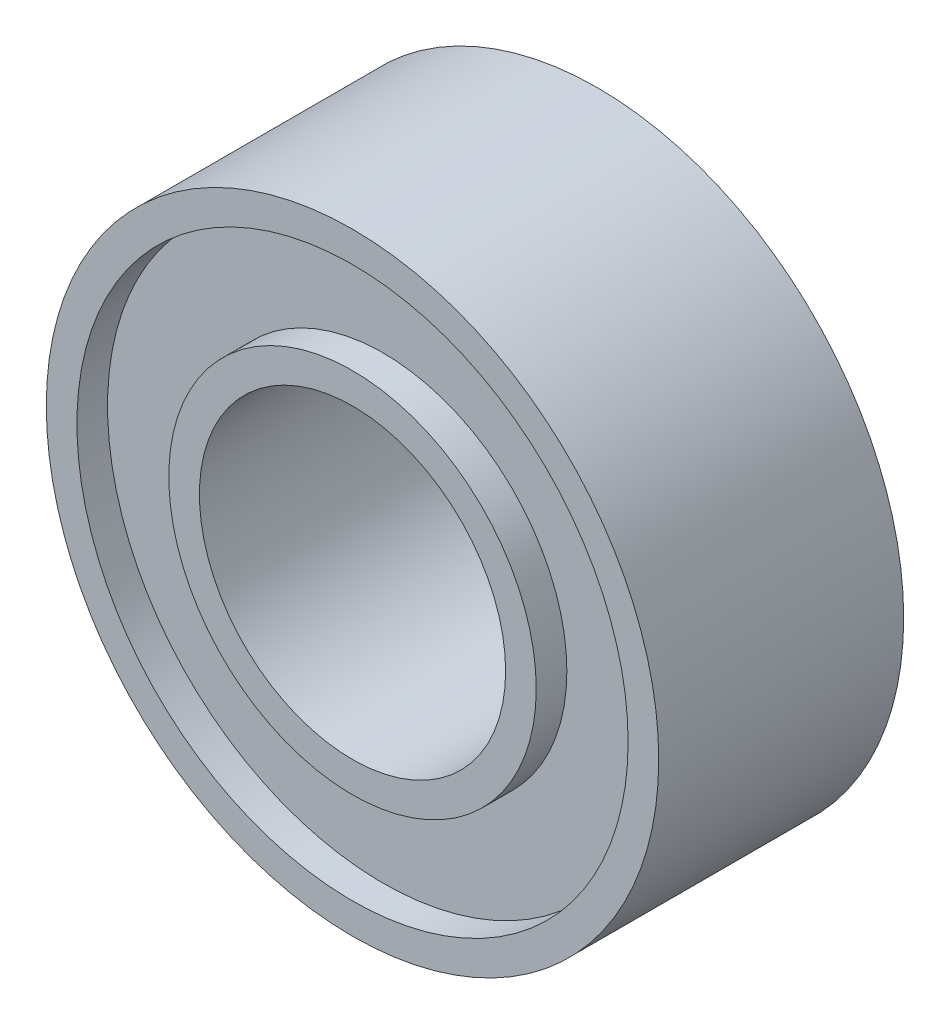
ISO-10303-21;
HEADER;
FILE_DESCRIPTION(('STEP AP214'),'2;1');
FILE_NAME('part.step','',(''),(''),'','','');
FILE_SCHEMA(('AUTOMOTIVE_DESIGN { 1 0 10303 214 1 1 1 1 }'));
ENDSEC;
DATA;
#1=APPLICATION_CONTEXT('core data for automotive mechanical design processes');
#2=APPLICATION_PROTOCOL_DEFINITION('international standard','automotive_design',2000,#1);
#3=PRODUCT_CONTEXT('',#1,'mechanical');
#4=PRODUCT('Part','Part','',(#3));
#5=PRODUCT_RELATED_PRODUCT_CATEGORY('part','',(#4));
#6=PRODUCT_DEFINITION_FORMATION('','',#4);
#7=PRODUCT_DEFINITION_CONTEXT('part definition',#1,'design');
#8=PRODUCT_DEFINITION('design','',#6,#7);
#9=PRODUCT_DEFINITION_SHAPE('','',#8);
#10=(LENGTH_UNIT() NAMED_UNIT(*) SI_UNIT(.MILLI.,.METRE.));
#11=(NAMED_UNIT(*) PLANE_ANGLE_UNIT() SI_UNIT($,.RADIAN.));
#12=(NAMED_UNIT(*) SI_UNIT($,.STERADIAN.) SOLID_ANGLE_UNIT());
#13=UNCERTAINTY_MEASURE_WITH_UNIT(LENGTH_MEASURE(1.E-05),#10,'distance_accuracy_value','');
#14=(GEOMETRIC_REPRESENTATION_CONTEXT(3) GLOBAL_UNCERTAINTY_ASSIGNED_CONTEXT((#13)) GLOBAL_UNIT_ASSIGNED_CONTEXT((#10,
#11,#12)) REPRESENTATION_CONTEXT('',''));
#15=CARTESIAN_POINT('',(0.,0.,0.));
#16=DIRECTION('',(0.,0.,1.));
#17=DIRECTION('',(1.,0.,0.));
#18=AXIS2_PLACEMENT_3D('',#15,#16,#17);
#19=CARTESIAN_POINT('',(0.,0.,0.));
#20=DIRECTION('',(0.,0.,1.));
#21=DIRECTION('',(1.,0.,0.));
#22=AXIS2_PLACEMENT_3D('',#19,#20,#21);
#23=PLANE('',#22);
#24=CARTESIAN_POINT('',(0.,0.,0.));
#25=DIRECTION('',(0.,0.,1.));
#26=DIRECTION('',(1.,0.,0.));
#27=AXIS2_PLACEMENT_3D('',#24,#25,#26);
#28=CIRCLE('',#27,2.5);
#29=CARTESIAN_POINT('',(2.5,0.,0.));
#30=VERTEX_POINT('',#29);
#31=EDGE_CURVE('E50',#30,#30,#28,.T.);
#32=ORIENTED_EDGE('',*,*,#31,.T.);
#33=EDGE_LOOP('',(#32));
#34=FACE_BOUND('',#33,.T.);
#35=CARTESIAN_POINT('',(0.,0.,0.));
#36=DIRECTION('',(0.,0.,1.));
#37=DIRECTION('',(1.,0.,0.));
#38=AXIS2_PLACEMENT_3D('',#35,#36,#37);
#39=CIRCLE('',#38,3.);
#40=CARTESIAN_POINT('',(3.,0.,0.));
#41=VERTEX_POINT('',#40);
#42=EDGE_CURVE('E74',#41,#41,#39,.T.);
#43=ORIENTED_EDGE('',*,*,#42,.F.);
#44=EDGE_LOOP('',(#43));
#45=FACE_BOUND('',#44,.T.);
#46=ADVANCED_FACE('F37',(#34,#45),#23,.F.);
#47=CARTESIAN_POINT('',(0.,0.,4.));
#48=DIRECTION('',(0.,0.,1.));
#49=DIRECTION('',(1.,0.,0.));
#50=AXIS2_PLACEMENT_3D('',#47,#48,#49);
#51=PLANE('',#50);
#52=CARTESIAN_POINT('',(0.,0.,4.));
#53=DIRECTION('',(0.,0.,1.));
#54=DIRECTION('',(1.,0.,0.));
#55=AXIS2_PLACEMENT_3D('',#52,#53,#54);
#56=CIRCLE('',#55,2.5);
#57=CARTESIAN_POINT('',(2.5,0.,4.));
#58=VERTEX_POINT('',#57);
#59=EDGE_CURVE('E48',#58,#58,#56,.T.);
#60=ORIENTED_EDGE('',*,*,#59,.F.);
#61=EDGE_LOOP('',(#60));
#62=FACE_BOUND('',#61,.T.);
#63=CARTESIAN_POINT('',(0.,0.,4.));
#64=DIRECTION('',(0.,0.,1.));
#65=DIRECTION('',(1.,0.,0.));
#66=AXIS2_PLACEMENT_3D('',#63,#64,#65);
#67=CIRCLE('',#66,3.);
#68=CARTESIAN_POINT('',(3.,0.,4.));
#69=VERTEX_POINT('',#68);
#70=EDGE_CURVE('E62',#69,#69,#67,.T.);
#71=ORIENTED_EDGE('',*,*,#70,.T.);
#72=EDGE_LOOP('',(#71));
#73=FACE_BOUND('',#72,.T.);
#74=ADVANCED_FACE('F90',(#62,#73),#51,.T.);
#75=CARTESIAN_POINT('',(0.,0.,4.));
#76=DIRECTION('',(0.,0.,1.));
#77=DIRECTION('',(1.,0.,0.));
#78=AXIS2_PLACEMENT_3D('',#75,#76,#77);
#79=CIRCLE('',#78,4.5);
#80=CARTESIAN_POINT('',(4.5,0.,4.));
#81=VERTEX_POINT('',#80);
#82=EDGE_CURVE('E56',#81,#81,#79,.T.);
#83=ORIENTED_EDGE('',*,*,#82,.F.);
#84=EDGE_LOOP('',(#83));
#85=FACE_BOUND('',#84,.T.);
#86=CARTESIAN_POINT('',(0.,0.,4.));
#87=DIRECTION('',(0.,0.,1.));
#88=DIRECTION('',(1.,0.,0.));
#89=AXIS2_PLACEMENT_3D('',#86,#87,#88);
#90=CIRCLE('',#89,5.);
#91=CARTESIAN_POINT('',(5.,0.,4.));
#92=VERTEX_POINT('',#91);
#93=EDGE_CURVE('E10',#92,#92,#90,.T.);
#94=ORIENTED_EDGE('',*,*,#93,.T.);
#95=EDGE_LOOP('',(#94));
#96=FACE_BOUND('',#95,.T.);
#97=ADVANCED_FACE('F98',(#85,#96),#51,.T.);
#98=CARTESIAN_POINT('',(0.,0.,0.));
#99=DIRECTION('',(0.,0.,1.));
#100=DIRECTION('',(1.,0.,0.));
#101=AXIS2_PLACEMENT_3D('',#98,#99,#100);
#102=CIRCLE('',#101,4.5);
#103=CARTESIAN_POINT('',(4.5,0.,0.));
#104=VERTEX_POINT('',#103);
#105=EDGE_CURVE('E68',#104,#104,#102,.T.);
#106=ORIENTED_EDGE('',*,*,#105,.T.);
#107=EDGE_LOOP('',(#106));
#108=FACE_BOUND('',#107,.T.);
#109=CARTESIAN_POINT('',(0.,0.,0.));
#110=DIRECTION('',(0.,0.,1.));
#111=DIRECTION('',(1.,0.,0.));
#112=AXIS2_PLACEMENT_3D('',#109,#110,#111);
#113=CIRCLE('',#112,5.);
#114=CARTESIAN_POINT('',(5.,0.,0.));
#115=VERTEX_POINT('',#114);
#116=EDGE_CURVE('E41',#115,#115,#113,.T.);
#117=ORIENTED_EDGE('',*,*,#116,.F.);
#118=EDGE_LOOP('',(#117));
#119=FACE_BOUND('',#118,.T.);
#120=ADVANCED_FACE('F92',(#108,#119),#23,.F.);
#121=CARTESIAN_POINT('',(0.,0.,4.));
#122=DIRECTION('',(0.,0.,-1.));
#123=DIRECTION('',(-1.,0.,0.));
#124=AXIS2_PLACEMENT_3D('',#121,#122,#123);
#125=CYLINDRICAL_SURFACE('',#124,5.);
#126=ORIENTED_EDGE('',*,*,#93,.F.);
#127=EDGE_LOOP('',(#126));
#128=FACE_BOUND('',#127,.T.);
#129=ORIENTED_EDGE('',*,*,#116,.T.);
#130=EDGE_LOOP('',(#129));
#131=FACE_BOUND('',#130,.T.);
#132=ADVANCED_FACE('F39',(#128,#131),#125,.T.);
#133=CARTESIAN_POINT('',(0.,0.,4.));
#134=DIRECTION('',(0.,0.,-1.));
#135=DIRECTION('',(-1.,0.,0.));
#136=AXIS2_PLACEMENT_3D('',#133,#134,#135);
#137=CYLINDRICAL_SURFACE('',#136,2.5);
#138=ORIENTED_EDGE('',*,*,#59,.T.);
#139=EDGE_LOOP('',(#138));
#140=FACE_BOUND('',#139,.T.);
#141=ORIENTED_EDGE('',*,*,#31,.F.);
#142=EDGE_LOOP('',(#141));
#143=FACE_BOUND('',#142,.T.);
#144=ADVANCED_FACE('F106',(#140,#143),#137,.F.);
#145=CARTESIAN_POINT('',(0.,0.,3.5));
#146=DIRECTION('',(0.,0.,1.));
#147=DIRECTION('',(1.,0.,0.));
#148=AXIS2_PLACEMENT_3D('',#145,#146,#147);
#149=CYLINDRICAL_SURFACE('',#148,4.5);
#150=CARTESIAN_POINT('',(0.,0.,3.5));
#151=DIRECTION('',(0.,0.,1.));
#152=DIRECTION('',(1.,0.,0.));
#153=AXIS2_PLACEMENT_3D('',#150,#151,#152);
#154=CIRCLE('',#153,4.5);
#155=CARTESIAN_POINT('',(4.5,0.,3.5));
#156=VERTEX_POINT('',#155);
#157=EDGE_CURVE('E53',#156,#156,#154,.T.);
#158=ORIENTED_EDGE('',*,*,#157,.F.);
#159=EDGE_LOOP('',(#158));
#160=FACE_BOUND('',#159,.T.);
#161=ORIENTED_EDGE('',*,*,#82,.T.);
#162=EDGE_LOOP('',(#161));
#163=FACE_BOUND('',#162,.T.);
#164=ADVANCED_FACE('F129',(#160,#163),#149,.F.);
#165=CARTESIAN_POINT('',(0.,0.,3.5));
#166=DIRECTION('',(0.,0.,1.));
#167=DIRECTION('',(1.,0.,0.));
#168=AXIS2_PLACEMENT_3D('',#165,#166,#167);
#169=PLANE('',#168);
#170=CARTESIAN_POINT('',(0.,0.,3.5));
#171=DIRECTION('',(0.,0.,1.));
#172=DIRECTION('',(1.,0.,0.));
#173=AXIS2_PLACEMENT_3D('',#170,#171,#172);
#174=CIRCLE('',#173,3.);
#175=CARTESIAN_POINT('',(3.,0.,3.5));
#176=VERTEX_POINT('',#175);
#177=EDGE_CURVE('E59',#176,#176,#174,.T.);
#178=ORIENTED_EDGE('',*,*,#177,.F.);
#179=EDGE_LOOP('',(#178));
#180=FACE_BOUND('',#179,.T.);
#181=ORIENTED_EDGE('',*,*,#157,.T.);
#182=EDGE_LOOP('',(#181));
#183=FACE_BOUND('',#182,.T.);
#184=ADVANCED_FACE('F125',(#180,#183),#169,.T.);
#185=CARTESIAN_POINT('',(0.,0.,3.5));
#186=DIRECTION('',(0.,0.,1.));
#187=DIRECTION('',(1.,0.,0.));
#188=AXIS2_PLACEMENT_3D('',#185,#186,#187);
#189=CYLINDRICAL_SURFACE('',#188,3.);
#190=ORIENTED_EDGE('',*,*,#177,.T.);
#191=EDGE_LOOP('',(#190));
#192=FACE_BOUND('',#191,.T.);
#193=ORIENTED_EDGE('',*,*,#70,.F.);
#194=EDGE_LOOP('',(#193));
#195=FACE_BOUND('',#194,.T.);
#196=ADVANCED_FACE('F120',(#192,#195),#189,.T.);
#197=CARTESIAN_POINT('',(0.,0.,0.5));
#198=DIRECTION('',(0.,0.,1.));
#199=DIRECTION('',(1.,0.,0.));
#200=AXIS2_PLACEMENT_3D('',#197,#198,#199);
#201=PLANE('',#200);
#202=CARTESIAN_POINT('',(0.,0.,0.5));
#203=DIRECTION('',(0.,0.,1.));
#204=DIRECTION('',(1.,0.,0.));
#205=AXIS2_PLACEMENT_3D('',#202,#203,#204);
#206=CIRCLE('',#205,4.5);
#207=CARTESIAN_POINT('',(4.5,0.,0.5));
#208=VERTEX_POINT('',#207);
#209=EDGE_CURVE('E65',#208,#208,#206,.T.);
#210=ORIENTED_EDGE('',*,*,#209,.F.);
#211=EDGE_LOOP('',(#210));
#212=FACE_BOUND('',#211,.T.);
#213=CARTESIAN_POINT('',(0.,0.,0.5));
#214=DIRECTION('',(0.,0.,1.));
#215=DIRECTION('',(1.,0.,0.));
#216=AXIS2_PLACEMENT_3D('',#213,#214,#215);
#217=CIRCLE('',#216,3.);
#218=CARTESIAN_POINT('',(3.,0.,0.5));
#219=VERTEX_POINT('',#218);
#220=EDGE_CURVE('E71',#219,#219,#217,.T.);
#221=ORIENTED_EDGE('',*,*,#220,.T.);
#222=EDGE_LOOP('',(#221));
#223=FACE_BOUND('',#222,.T.);
#224=ADVANCED_FACE('F80',(#212,#223),#201,.F.);
#225=CARTESIAN_POINT('',(0.,0.,0.5));
#226=DIRECTION('',(0.,0.,-1.));
#227=DIRECTION('',(-1.,0.,0.));
#228=AXIS2_PLACEMENT_3D('',#225,#226,#227);
#229=CYLINDRICAL_SURFACE('',#228,4.5);
#230=ORIENTED_EDGE('',*,*,#209,.T.);
#231=EDGE_LOOP('',(#230));
#232=FACE_BOUND('',#231,.T.);
#233=ORIENTED_EDGE('',*,*,#105,.F.);
#234=EDGE_LOOP('',(#233));
#235=FACE_BOUND('',#234,.T.);
#236=ADVANCED_FACE('F85',(#232,#235),#229,.F.);
#237=CARTESIAN_POINT('',(0.,0.,0.5));
#238=DIRECTION('',(0.,0.,-1.));
#239=DIRECTION('',(-1.,0.,0.));
#240=AXIS2_PLACEMENT_3D('',#237,#238,#239);
#241=CYLINDRICAL_SURFACE('',#240,3.);
#242=ORIENTED_EDGE('',*,*,#220,.F.);
#243=EDGE_LOOP('',(#242));
#244=FACE_BOUND('',#243,.T.);
#245=ORIENTED_EDGE('',*,*,#42,.T.);
#246=EDGE_LOOP('',(#245));
#247=FACE_BOUND('',#246,.T.);
#248=ADVANCED_FACE('F82',(#244,#247),#241,.T.);
#249=CLOSED_SHELL('',(#46,#74,#97,#120,#132,#144,#164,#184,#196,#224,#236,#248));
#250=MANIFOLD_SOLID_BREP('B2',#249);
#251=ADVANCED_BREP_SHAPE_REPRESENTATION('',(#18,#250),#14);
#252=SHAPE_DEFINITION_REPRESENTATION(#9,#251);
ENDSEC;
END-ISO-10303-21;
